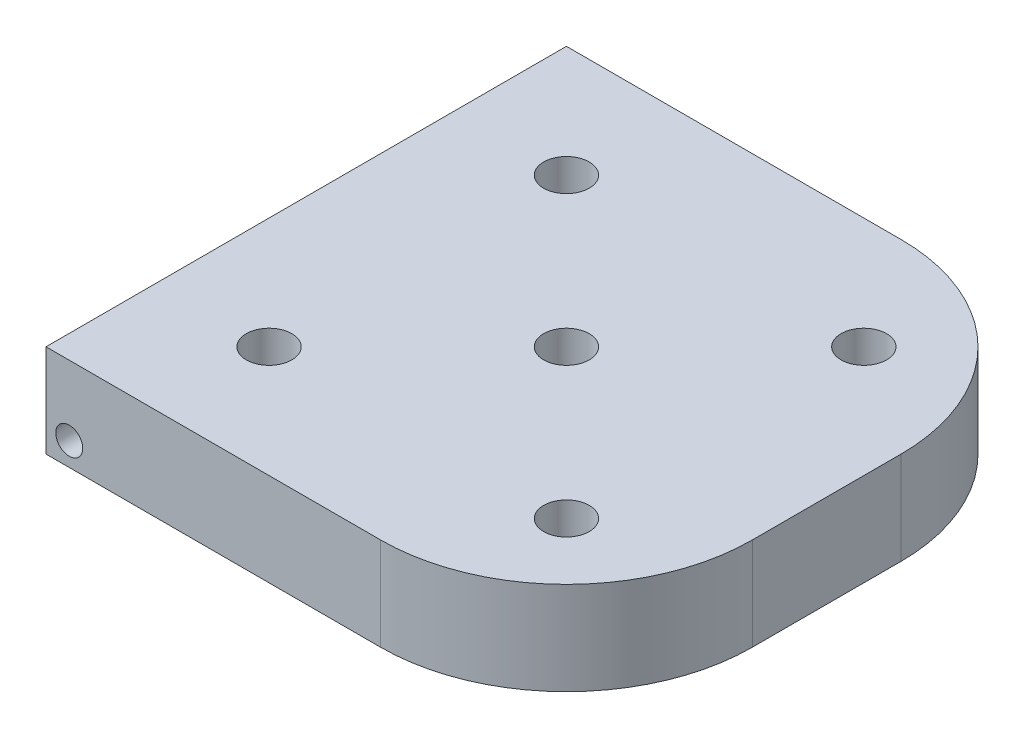
ISO-10303-21;
HEADER;
FILE_DESCRIPTION(('STEP AP214'),'2;1');
FILE_NAME('part.step','',(''),(''),'','','');
FILE_SCHEMA(('AUTOMOTIVE_DESIGN { 1 0 10303 214 1 1 1 1 }'));
ENDSEC;
DATA;
#1=APPLICATION_CONTEXT('core data for automotive mechanical design processes');
#2=APPLICATION_PROTOCOL_DEFINITION('international standard','automotive_design',2000,#1);
#3=PRODUCT_CONTEXT('',#1,'mechanical');
#4=PRODUCT('Part','Part','',(#3));
#5=PRODUCT_RELATED_PRODUCT_CATEGORY('part','',(#4));
#6=PRODUCT_DEFINITION_FORMATION('','',#4);
#7=PRODUCT_DEFINITION_CONTEXT('part definition',#1,'design');
#8=PRODUCT_DEFINITION('design','',#6,#7);
#9=PRODUCT_DEFINITION_SHAPE('','',#8);
#10=(LENGTH_UNIT() NAMED_UNIT(*) SI_UNIT(.MILLI.,.METRE.));
#11=(NAMED_UNIT(*) PLANE_ANGLE_UNIT() SI_UNIT($,.RADIAN.));
#12=(NAMED_UNIT(*) SI_UNIT($,.STERADIAN.) SOLID_ANGLE_UNIT());
#13=UNCERTAINTY_MEASURE_WITH_UNIT(LENGTH_MEASURE(1.E-05),#10,'distance_accuracy_value','');
#14=(GEOMETRIC_REPRESENTATION_CONTEXT(3) GLOBAL_UNCERTAINTY_ASSIGNED_CONTEXT((#13)) GLOBAL_UNIT_ASSIGNED_CONTEXT((#10,
#11,#12)) REPRESENTATION_CONTEXT('',''));
#15=CARTESIAN_POINT('',(0.,0.,0.));
#16=DIRECTION('',(0.,0.,1.));
#17=DIRECTION('',(1.,0.,0.));
#18=AXIS2_PLACEMENT_3D('',#15,#16,#17);
#19=CARTESIAN_POINT('',(0.,10.,0.));
#20=DIRECTION('',(0.,-1.,0.));
#21=DIRECTION('',(0.,0.,-1.));
#22=AXIS2_PLACEMENT_3D('',#19,#20,#21);
#23=PLANE('',#22);
#24=DIRECTION('',(0.,0.,-1.));
#25=VECTOR('',#24,1.);
#26=CARTESIAN_POINT('',(56.,10.,0.));
#27=LINE('',#26,#25);
#28=CARTESIAN_POINT('',(56.,10.,-20.));
#29=VERTEX_POINT('',#28);
#30=CARTESIAN_POINT('',(56.,10.,-36.));
#31=VERTEX_POINT('',#30);
#32=EDGE_CURVE('E101',#29,#31,#27,.T.);
#33=ORIENTED_EDGE('',*,*,#32,.T.);
#34=CARTESIAN_POINT('',(36.,10.,-36.));
#35=DIRECTION('',(0.,-1.,0.));
#36=DIRECTION('',(0.,0.,-1.));
#37=AXIS2_PLACEMENT_3D('',#34,#35,#36);
#38=CIRCLE('',#37,20.);
#39=CARTESIAN_POINT('',(36.,10.,-56.));
#40=VERTEX_POINT('',#39);
#41=EDGE_CURVE('E48',#31,#40,#38,.F.);
#42=ORIENTED_EDGE('',*,*,#41,.T.);
#43=DIRECTION('',(-1.,0.,0.));
#44=VECTOR('',#43,1.);
#45=CARTESIAN_POINT('',(0.,10.,-56.));
#46=LINE('',#45,#44);
#47=CARTESIAN_POINT('',(0.,10.,-56.));
#48=VERTEX_POINT('',#47);
#49=EDGE_CURVE('E107',#40,#48,#46,.T.);
#50=ORIENTED_EDGE('',*,*,#49,.T.);
#51=DIRECTION('',(0.,0.,1.));
#52=VECTOR('',#51,1.);
#53=CARTESIAN_POINT('',(0.,10.,0.));
#54=LINE('',#53,#52);
#55=CARTESIAN_POINT('',(0.,10.,0.));
#56=VERTEX_POINT('',#55);
#57=EDGE_CURVE('E102',#48,#56,#54,.T.);
#58=ORIENTED_EDGE('',*,*,#57,.T.);
#59=DIRECTION('',(1.,0.,0.));
#60=VECTOR('',#59,1.);
#61=CARTESIAN_POINT('',(0.,10.,0.));
#62=LINE('',#61,#60);
#63=CARTESIAN_POINT('',(36.,10.,0.));
#64=VERTEX_POINT('',#63);
#65=EDGE_CURVE('E92',#56,#64,#62,.T.);
#66=ORIENTED_EDGE('',*,*,#65,.T.);
#67=CARTESIAN_POINT('',(36.,10.,-20.));
#68=DIRECTION('',(0.,-1.,0.));
#69=DIRECTION('',(0.,0.,-1.));
#70=AXIS2_PLACEMENT_3D('',#67,#68,#69);
#71=CIRCLE('',#70,20.);
#72=EDGE_CURVE('E140',#64,#29,#71,.F.);
#73=ORIENTED_EDGE('',*,*,#72,.T.);
#74=EDGE_LOOP('',(#33,#42,#50,#58,#66,#73));
#75=FACE_BOUND('',#74,.T.);
#76=CARTESIAN_POINT('',(28.,10.,-28.));
#77=DIRECTION('',(0.,1.,0.));
#78=DIRECTION('',(0.,0.,1.));
#79=AXIS2_PLACEMENT_3D('',#76,#77,#78);
#80=CIRCLE('',#79,2.45);
#81=CARTESIAN_POINT('',(28.,10.,-25.55));
#82=VERTEX_POINT('',#81);
#83=EDGE_CURVE('E167',#82,#82,#80,.T.);
#84=ORIENTED_EDGE('',*,*,#83,.F.);
#85=EDGE_LOOP('',(#84));
#86=FACE_BOUND('',#85,.T.);
#87=CARTESIAN_POINT('',(12.,10.,-44.));
#88=DIRECTION('',(0.,1.,0.));
#89=DIRECTION('',(0.,0.,1.));
#90=AXIS2_PLACEMENT_3D('',#87,#88,#89);
#91=CIRCLE('',#90,2.45);
#92=CARTESIAN_POINT('',(12.,10.,-41.55));
#93=VERTEX_POINT('',#92);
#94=EDGE_CURVE('E175',#93,#93,#91,.T.);
#95=ORIENTED_EDGE('',*,*,#94,.F.);
#96=EDGE_LOOP('',(#95));
#97=FACE_BOUND('',#96,.T.);
#98=CARTESIAN_POINT('',(44.,10.,-44.));
#99=DIRECTION('',(0.,1.,0.));
#100=DIRECTION('',(0.,0.,1.));
#101=AXIS2_PLACEMENT_3D('',#98,#99,#100);
#102=CIRCLE('',#101,2.45);
#103=CARTESIAN_POINT('',(44.,10.,-41.55));
#104=VERTEX_POINT('',#103);
#105=EDGE_CURVE('E183',#104,#104,#102,.T.);
#106=ORIENTED_EDGE('',*,*,#105,.F.);
#107=EDGE_LOOP('',(#106));
#108=FACE_BOUND('',#107,.T.);
#109=CARTESIAN_POINT('',(44.,10.,-12.));
#110=DIRECTION('',(0.,1.,0.));
#111=DIRECTION('',(0.,0.,1.));
#112=AXIS2_PLACEMENT_3D('',#109,#110,#111);
#113=CIRCLE('',#112,2.45);
#114=CARTESIAN_POINT('',(44.,10.,-9.55));
#115=VERTEX_POINT('',#114);
#116=EDGE_CURVE('E191',#115,#115,#113,.T.);
#117=ORIENTED_EDGE('',*,*,#116,.F.);
#118=EDGE_LOOP('',(#117));
#119=FACE_BOUND('',#118,.T.);
#120=CARTESIAN_POINT('',(12.,10.,-12.));
#121=DIRECTION('',(0.,1.,0.));
#122=DIRECTION('',(0.,0.,1.));
#123=AXIS2_PLACEMENT_3D('',#120,#121,#122);
#124=CIRCLE('',#123,2.45000000000001);
#125=CARTESIAN_POINT('',(12.,10.,-9.55));
#126=VERTEX_POINT('',#125);
#127=EDGE_CURVE('E199',#126,#126,#124,.T.);
#128=ORIENTED_EDGE('',*,*,#127,.F.);
#129=EDGE_LOOP('',(#128));
#130=FACE_BOUND('',#129,.T.);
#131=ADVANCED_FACE('F39',(#75,#86,#97,#108,#119,#130),#23,.F.);
#132=CARTESIAN_POINT('',(0.,0.,0.));
#133=DIRECTION('',(0.,-1.,0.));
#134=DIRECTION('',(0.,0.,-1.));
#135=AXIS2_PLACEMENT_3D('',#132,#133,#134);
#136=PLANE('',#135);
#137=CARTESIAN_POINT('',(44.,0.,-12.));
#138=DIRECTION('',(0.,1.,0.));
#139=DIRECTION('',(0.,0.,1.));
#140=AXIS2_PLACEMENT_3D('',#137,#138,#139);
#141=CIRCLE('',#140,2.45);
#142=CARTESIAN_POINT('',(44.,0.,-9.55));
#143=VERTEX_POINT('',#142);
#144=EDGE_CURVE('E195',#143,#143,#141,.T.);
#145=ORIENTED_EDGE('',*,*,#144,.T.);
#146=EDGE_LOOP('',(#145));
#147=FACE_BOUND('',#146,.T.);
#148=CARTESIAN_POINT('',(12.,0.,-44.));
#149=DIRECTION('',(0.,1.,0.));
#150=DIRECTION('',(0.,0.,1.));
#151=AXIS2_PLACEMENT_3D('',#148,#149,#150);
#152=CIRCLE('',#151,2.45);
#153=CARTESIAN_POINT('',(12.,0.,-41.55));
#154=VERTEX_POINT('',#153);
#155=EDGE_CURVE('E179',#154,#154,#152,.T.);
#156=ORIENTED_EDGE('',*,*,#155,.T.);
#157=EDGE_LOOP('',(#156));
#158=FACE_BOUND('',#157,.T.);
#159=DIRECTION('',(-1.,0.,0.));
#160=VECTOR('',#159,1.);
#161=CARTESIAN_POINT('',(0.,0.,-56.));
#162=LINE('',#161,#160);
#163=CARTESIAN_POINT('',(36.,0.,-56.));
#164=VERTEX_POINT('',#163);
#165=CARTESIAN_POINT('',(0.,0.,-56.));
#166=VERTEX_POINT('',#165);
#167=EDGE_CURVE('E112',#164,#166,#162,.T.);
#168=ORIENTED_EDGE('',*,*,#167,.F.);
#169=CARTESIAN_POINT('',(36.,0.,-36.));
#170=DIRECTION('',(0.,-1.,0.));
#171=DIRECTION('',(0.,0.,-1.));
#172=AXIS2_PLACEMENT_3D('',#169,#170,#171);
#173=CIRCLE('',#172,20.);
#174=CARTESIAN_POINT('',(56.,0.,-36.));
#175=VERTEX_POINT('',#174);
#176=EDGE_CURVE('E131',#164,#175,#173,.T.);
#177=ORIENTED_EDGE('',*,*,#176,.T.);
#178=DIRECTION('',(0.,0.,-1.));
#179=VECTOR('',#178,1.);
#180=CARTESIAN_POINT('',(56.,0.,0.));
#181=LINE('',#180,#179);
#182=CARTESIAN_POINT('',(56.,0.,-20.));
#183=VERTEX_POINT('',#182);
#184=EDGE_CURVE('E156',#183,#175,#181,.T.);
#185=ORIENTED_EDGE('',*,*,#184,.F.);
#186=CARTESIAN_POINT('',(36.,0.,-20.));
#187=DIRECTION('',(0.,-1.,0.));
#188=DIRECTION('',(0.,0.,-1.));
#189=AXIS2_PLACEMENT_3D('',#186,#187,#188);
#190=CIRCLE('',#189,20.);
#191=CARTESIAN_POINT('',(36.,0.,0.));
#192=VERTEX_POINT('',#191);
#193=EDGE_CURVE('E124',#183,#192,#190,.T.);
#194=ORIENTED_EDGE('',*,*,#193,.T.);
#195=DIRECTION('',(1.,0.,0.));
#196=VECTOR('',#195,1.);
#197=CARTESIAN_POINT('',(0.,0.,0.));
#198=LINE('',#197,#196);
#199=CARTESIAN_POINT('',(0.,0.,0.));
#200=VERTEX_POINT('',#199);
#201=EDGE_CURVE('E160',#200,#192,#198,.T.);
#202=ORIENTED_EDGE('',*,*,#201,.F.);
#203=DIRECTION('',(0.,0.,1.));
#204=VECTOR('',#203,1.);
#205=CARTESIAN_POINT('',(0.,0.,0.));
#206=LINE('',#205,#204);
#207=EDGE_CURVE('E116',#166,#200,#206,.T.);
#208=ORIENTED_EDGE('',*,*,#207,.F.);
#209=EDGE_LOOP('',(#168,#177,#185,#194,#202,#208));
#210=FACE_BOUND('',#209,.T.);
#211=CARTESIAN_POINT('',(28.,0.,-28.));
#212=DIRECTION('',(0.,1.,0.));
#213=DIRECTION('',(0.,0.,1.));
#214=AXIS2_PLACEMENT_3D('',#211,#212,#213);
#215=CIRCLE('',#214,2.45);
#216=CARTESIAN_POINT('',(28.,0.,-25.55));
#217=VERTEX_POINT('',#216);
#218=EDGE_CURVE('E171',#217,#217,#215,.T.);
#219=ORIENTED_EDGE('',*,*,#218,.T.);
#220=EDGE_LOOP('',(#219));
#221=FACE_BOUND('',#220,.T.);
#222=CARTESIAN_POINT('',(44.,0.,-44.));
#223=DIRECTION('',(0.,1.,0.));
#224=DIRECTION('',(0.,0.,1.));
#225=AXIS2_PLACEMENT_3D('',#222,#223,#224);
#226=CIRCLE('',#225,2.45);
#227=CARTESIAN_POINT('',(44.,0.,-41.55));
#228=VERTEX_POINT('',#227);
#229=EDGE_CURVE('E187',#228,#228,#226,.T.);
#230=ORIENTED_EDGE('',*,*,#229,.T.);
#231=EDGE_LOOP('',(#230));
#232=FACE_BOUND('',#231,.T.);
#233=CARTESIAN_POINT('',(12.,0.,-12.));
#234=DIRECTION('',(0.,1.,0.));
#235=DIRECTION('',(0.,0.,1.));
#236=AXIS2_PLACEMENT_3D('',#233,#234,#235);
#237=CIRCLE('',#236,2.45000000000001);
#238=CARTESIAN_POINT('',(12.,0.,-9.55));
#239=VERTEX_POINT('',#238);
#240=EDGE_CURVE('E203',#239,#239,#237,.T.);
#241=ORIENTED_EDGE('',*,*,#240,.T.);
#242=EDGE_LOOP('',(#241));
#243=FACE_BOUND('',#242,.T.);
#244=ADVANCED_FACE('F154',(#147,#158,#210,#221,#232,#243),#136,.T.);
#245=CARTESIAN_POINT('',(0.,10.,0.));
#246=DIRECTION('',(1.,0.,0.));
#247=DIRECTION('',(0.,0.,-1.));
#248=AXIS2_PLACEMENT_3D('',#245,#246,#247);
#249=PLANE('',#248);
#250=ORIENTED_EDGE('',*,*,#207,.T.);
#251=DIRECTION('',(0.,-1.,0.));
#252=VECTOR('',#251,1.);
#253=CARTESIAN_POINT('',(0.,10.,0.));
#254=LINE('',#253,#252);
#255=EDGE_CURVE('E96',#56,#200,#254,.T.);
#256=ORIENTED_EDGE('',*,*,#255,.F.);
#257=ORIENTED_EDGE('',*,*,#57,.F.);
#258=DIRECTION('',(0.,-1.,0.));
#259=VECTOR('',#258,1.);
#260=CARTESIAN_POINT('',(0.,10.,-56.));
#261=LINE('',#260,#259);
#262=EDGE_CURVE('E119',#48,#166,#261,.T.);
#263=ORIENTED_EDGE('',*,*,#262,.T.);
#264=EDGE_LOOP('',(#250,#256,#257,#263));
#265=FACE_BOUND('',#264,.T.);
#266=ADVANCED_FACE('F114',(#265),#249,.F.);
#267=CARTESIAN_POINT('',(0.,10.,0.));
#268=DIRECTION('',(0.,0.,-1.));
#269=DIRECTION('',(-1.,0.,0.));
#270=AXIS2_PLACEMENT_3D('',#267,#268,#269);
#271=PLANE('',#270);
#272=CARTESIAN_POINT('',(2.5,2.5,0.));
#273=DIRECTION('',(0.,0.,1.));
#274=DIRECTION('',(1.,0.,0.));
#275=AXIS2_PLACEMENT_3D('',#272,#273,#274);
#276=CIRCLE('',#275,1.45);
#277=CARTESIAN_POINT('',(3.95,2.5,0.));
#278=VERTEX_POINT('',#277);
#279=EDGE_CURVE('E211',#278,#278,#276,.T.);
#280=ORIENTED_EDGE('',*,*,#279,.F.);
#281=EDGE_LOOP('',(#280));
#282=FACE_BOUND('',#281,.T.);
#283=ORIENTED_EDGE('',*,*,#201,.T.);
#284=DIRECTION('',(0.,-1.,0.));
#285=VECTOR('',#284,1.);
#286=CARTESIAN_POINT('',(36.,10.,0.));
#287=LINE('',#286,#285);
#288=EDGE_CURVE('E11',#192,#64,#287,.F.);
#289=ORIENTED_EDGE('',*,*,#288,.T.);
#290=ORIENTED_EDGE('',*,*,#65,.F.);
#291=ORIENTED_EDGE('',*,*,#255,.T.);
#292=EDGE_LOOP('',(#283,#289,#290,#291));
#293=FACE_BOUND('',#292,.T.);
#294=ADVANCED_FACE('F94',(#282,#293),#271,.F.);
#295=CARTESIAN_POINT('',(56.,10.,0.));
#296=DIRECTION('',(-1.,0.,0.));
#297=DIRECTION('',(0.,0.,1.));
#298=AXIS2_PLACEMENT_3D('',#295,#296,#297);
#299=PLANE('',#298);
#300=ORIENTED_EDGE('',*,*,#184,.T.);
#301=DIRECTION('',(0.,-1.,0.));
#302=VECTOR('',#301,1.);
#303=CARTESIAN_POINT('',(56.,10.,-36.));
#304=LINE('',#303,#302);
#305=EDGE_CURVE('E61',#175,#31,#304,.F.);
#306=ORIENTED_EDGE('',*,*,#305,.T.);
#307=ORIENTED_EDGE('',*,*,#32,.F.);
#308=DIRECTION('',(0.,-1.,0.));
#309=VECTOR('',#308,1.);
#310=CARTESIAN_POINT('',(56.,10.,-20.));
#311=LINE('',#310,#309);
#312=EDGE_CURVE('E134',#29,#183,#311,.T.);
#313=ORIENTED_EDGE('',*,*,#312,.T.);
#314=EDGE_LOOP('',(#300,#306,#307,#313));
#315=FACE_BOUND('',#314,.T.);
#316=ADVANCED_FACE('F157',(#315),#299,.F.);
#317=CARTESIAN_POINT('',(0.,10.,-56.));
#318=DIRECTION('',(0.,0.,1.));
#319=DIRECTION('',(1.,0.,0.));
#320=AXIS2_PLACEMENT_3D('',#317,#318,#319);
#321=PLANE('',#320);
#322=CARTESIAN_POINT('',(2.5,2.5,-56.));
#323=DIRECTION('',(0.,0.,1.));
#324=DIRECTION('',(1.,0.,0.));
#325=AXIS2_PLACEMENT_3D('',#322,#323,#324);
#326=CIRCLE('',#325,1.45);
#327=CARTESIAN_POINT('',(3.95,2.5,-56.));
#328=VERTEX_POINT('',#327);
#329=EDGE_CURVE('E207',#328,#328,#326,.T.);
#330=ORIENTED_EDGE('',*,*,#329,.T.);
#331=EDGE_LOOP('',(#330));
#332=FACE_BOUND('',#331,.T.);
#333=ORIENTED_EDGE('',*,*,#49,.F.);
#334=DIRECTION('',(0.,-1.,0.));
#335=VECTOR('',#334,1.);
#336=CARTESIAN_POINT('',(36.,10.,-56.));
#337=LINE('',#336,#335);
#338=EDGE_CURVE('E118',#40,#164,#337,.T.);
#339=ORIENTED_EDGE('',*,*,#338,.T.);
#340=ORIENTED_EDGE('',*,*,#167,.T.);
#341=ORIENTED_EDGE('',*,*,#262,.F.);
#342=EDGE_LOOP('',(#333,#339,#340,#341));
#343=FACE_BOUND('',#342,.T.);
#344=ADVANCED_FACE('F147',(#332,#343),#321,.F.);
#345=CARTESIAN_POINT('',(28.,10.,-28.));
#346=DIRECTION('',(0.,-1.,0.));
#347=DIRECTION('',(0.,0.,-1.));
#348=AXIS2_PLACEMENT_3D('',#345,#346,#347);
#349=CYLINDRICAL_SURFACE('',#348,2.45);
#350=ORIENTED_EDGE('',*,*,#83,.T.);
#351=EDGE_LOOP('',(#350));
#352=FACE_BOUND('',#351,.T.);
#353=ORIENTED_EDGE('',*,*,#218,.F.);
#354=EDGE_LOOP('',(#353));
#355=FACE_BOUND('',#354,.T.);
#356=ADVANCED_FACE('F243',(#352,#355),#349,.F.);
#357=CARTESIAN_POINT('',(12.,10.,-44.));
#358=DIRECTION('',(0.,-1.,0.));
#359=DIRECTION('',(0.,0.,-1.));
#360=AXIS2_PLACEMENT_3D('',#357,#358,#359);
#361=CYLINDRICAL_SURFACE('',#360,2.45);
#362=ORIENTED_EDGE('',*,*,#94,.T.);
#363=EDGE_LOOP('',(#362));
#364=FACE_BOUND('',#363,.T.);
#365=ORIENTED_EDGE('',*,*,#155,.F.);
#366=EDGE_LOOP('',(#365));
#367=FACE_BOUND('',#366,.T.);
#368=ADVANCED_FACE('F250',(#364,#367),#361,.F.);
#369=CARTESIAN_POINT('',(44.,10.,-44.));
#370=DIRECTION('',(0.,-1.,0.));
#371=DIRECTION('',(0.,0.,-1.));
#372=AXIS2_PLACEMENT_3D('',#369,#370,#371);
#373=CYLINDRICAL_SURFACE('',#372,2.45);
#374=ORIENTED_EDGE('',*,*,#105,.T.);
#375=EDGE_LOOP('',(#374));
#376=FACE_BOUND('',#375,.T.);
#377=ORIENTED_EDGE('',*,*,#229,.F.);
#378=EDGE_LOOP('',(#377));
#379=FACE_BOUND('',#378,.T.);
#380=ADVANCED_FACE('F255',(#376,#379),#373,.F.);
#381=CARTESIAN_POINT('',(44.,10.,-12.));
#382=DIRECTION('',(0.,-1.,0.));
#383=DIRECTION('',(0.,0.,-1.));
#384=AXIS2_PLACEMENT_3D('',#381,#382,#383);
#385=CYLINDRICAL_SURFACE('',#384,2.45);
#386=ORIENTED_EDGE('',*,*,#116,.T.);
#387=EDGE_LOOP('',(#386));
#388=FACE_BOUND('',#387,.T.);
#389=ORIENTED_EDGE('',*,*,#144,.F.);
#390=EDGE_LOOP('',(#389));
#391=FACE_BOUND('',#390,.T.);
#392=ADVANCED_FACE('F266',(#388,#391),#385,.F.);
#393=CARTESIAN_POINT('',(12.,10.,-12.));
#394=DIRECTION('',(0.,-1.,0.));
#395=DIRECTION('',(0.,0.,-1.));
#396=AXIS2_PLACEMENT_3D('',#393,#394,#395);
#397=CYLINDRICAL_SURFACE('',#396,2.45000000000001);
#398=ORIENTED_EDGE('',*,*,#127,.T.);
#399=EDGE_LOOP('',(#398));
#400=FACE_BOUND('',#399,.T.);
#401=ORIENTED_EDGE('',*,*,#240,.F.);
#402=EDGE_LOOP('',(#401));
#403=FACE_BOUND('',#402,.T.);
#404=ADVANCED_FACE('F223',(#400,#403),#397,.F.);
#405=CARTESIAN_POINT('',(2.5,2.5,-56.));
#406=DIRECTION('',(0.,0.,1.));
#407=DIRECTION('',(1.,0.,0.));
#408=AXIS2_PLACEMENT_3D('',#405,#406,#407);
#409=CYLINDRICAL_SURFACE('',#408,1.45);
#410=ORIENTED_EDGE('',*,*,#329,.F.);
#411=EDGE_LOOP('',(#410));
#412=FACE_BOUND('',#411,.T.);
#413=ORIENTED_EDGE('',*,*,#279,.T.);
#414=EDGE_LOOP('',(#413));
#415=FACE_BOUND('',#414,.T.);
#416=ADVANCED_FACE('F220',(#412,#415),#409,.F.);
#417=CARTESIAN_POINT('',(36.,10.,-36.));
#418=DIRECTION('',(0.,-1.,0.));
#419=DIRECTION('',(0.,0.,-1.));
#420=AXIS2_PLACEMENT_3D('',#417,#418,#419);
#421=CYLINDRICAL_SURFACE('',#420,20.);
#422=ORIENTED_EDGE('',*,*,#41,.F.);
#423=ORIENTED_EDGE('',*,*,#305,.F.);
#424=ORIENTED_EDGE('',*,*,#176,.F.);
#425=ORIENTED_EDGE('',*,*,#338,.F.);
#426=EDGE_LOOP('',(#422,#423,#424,#425));
#427=FACE_BOUND('',#426,.T.);
#428=ADVANCED_FACE('F151',(#427),#421,.T.);
#429=CARTESIAN_POINT('',(36.,10.,-20.));
#430=DIRECTION('',(0.,-1.,0.));
#431=DIRECTION('',(0.,0.,-1.));
#432=AXIS2_PLACEMENT_3D('',#429,#430,#431);
#433=CYLINDRICAL_SURFACE('',#432,20.);
#434=ORIENTED_EDGE('',*,*,#72,.F.);
#435=ORIENTED_EDGE('',*,*,#288,.F.);
#436=ORIENTED_EDGE('',*,*,#193,.F.);
#437=ORIENTED_EDGE('',*,*,#312,.F.);
#438=EDGE_LOOP('',(#434,#435,#436,#437));
#439=FACE_BOUND('',#438,.T.);
#440=ADVANCED_FACE('F41',(#439),#433,.T.);
#441=CLOSED_SHELL('',(#131,#244,#266,#294,#316,#344,#356,#368,#380,#392,#404,#416,#428,#440));
#442=MANIFOLD_SOLID_BREP('B2',#441);
#443=ADVANCED_BREP_SHAPE_REPRESENTATION('',(#18,#442),#14);
#444=SHAPE_DEFINITION_REPRESENTATION(#9,#443);
ENDSEC;
END-ISO-10303-21;
